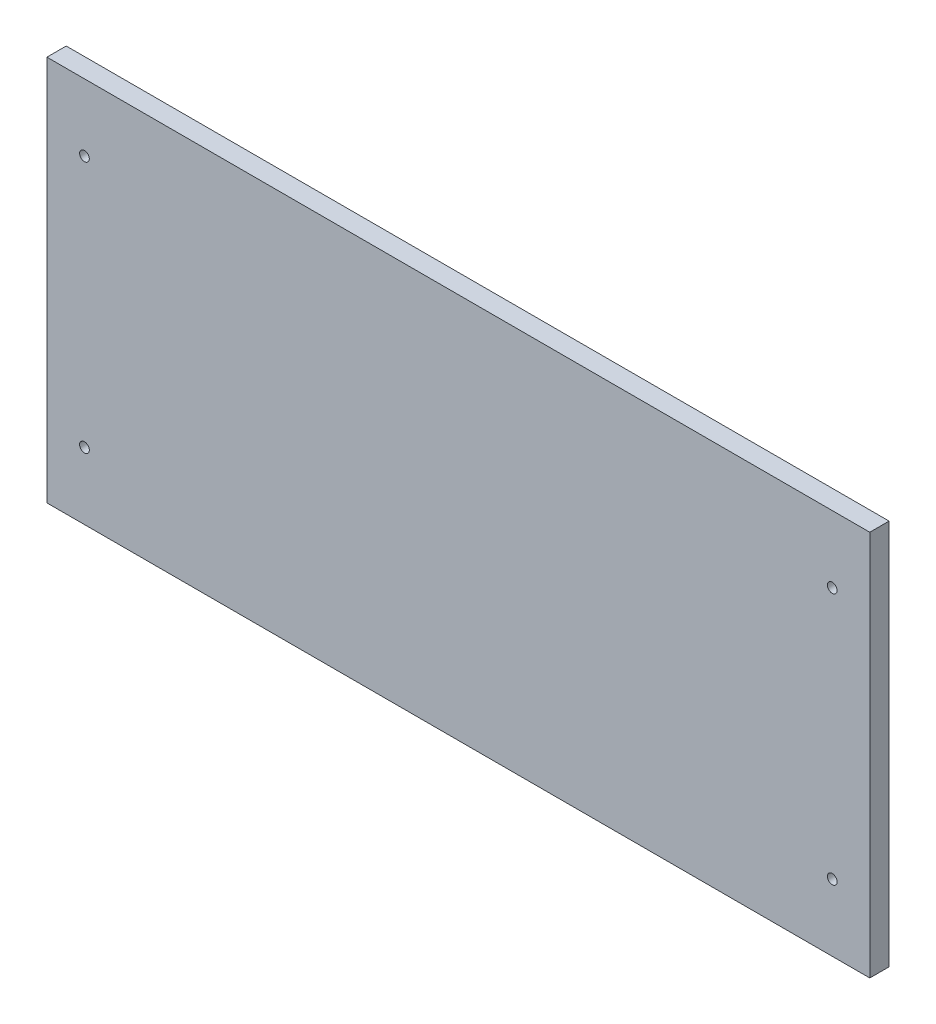
ISO-10303-21;
HEADER;
FILE_DESCRIPTION(('STEP AP214'),'2;1');
FILE_NAME('part.step','',(''),(''),'','','');
FILE_SCHEMA(('AUTOMOTIVE_DESIGN { 1 0 10303 214 1 1 1 1 }'));
ENDSEC;
DATA;
#1=APPLICATION_CONTEXT('core data for automotive mechanical design processes');
#2=APPLICATION_PROTOCOL_DEFINITION('international standard','automotive_design',2000,#1);
#3=PRODUCT_CONTEXT('',#1,'mechanical');
#4=PRODUCT('Part','Part','',(#3));
#5=PRODUCT_RELATED_PRODUCT_CATEGORY('part','',(#4));
#6=PRODUCT_DEFINITION_FORMATION('','',#4);
#7=PRODUCT_DEFINITION_CONTEXT('part definition',#1,'design');
#8=PRODUCT_DEFINITION('design','',#6,#7);
#9=PRODUCT_DEFINITION_SHAPE('','',#8);
#10=(LENGTH_UNIT() NAMED_UNIT(*) SI_UNIT(.MILLI.,.METRE.));
#11=(NAMED_UNIT(*) PLANE_ANGLE_UNIT() SI_UNIT($,.RADIAN.));
#12=(NAMED_UNIT(*) SI_UNIT($,.STERADIAN.) SOLID_ANGLE_UNIT());
#13=UNCERTAINTY_MEASURE_WITH_UNIT(LENGTH_MEASURE(1.E-05),#10,'distance_accuracy_value','');
#14=(GEOMETRIC_REPRESENTATION_CONTEXT(3) GLOBAL_UNCERTAINTY_ASSIGNED_CONTEXT((#13)) GLOBAL_UNIT_ASSIGNED_CONTEXT((#10,
#11,#12)) REPRESENTATION_CONTEXT('',''));
#15=CARTESIAN_POINT('',(0.,0.,0.));
#16=DIRECTION('',(0.,0.,1.));
#17=DIRECTION('',(1.,0.,0.));
#18=AXIS2_PLACEMENT_3D('',#15,#16,#17);
#19=CARTESIAN_POINT('',(0.,0.,6.35));
#20=DIRECTION('',(0.,0.,-1.));
#21=DIRECTION('',(-1.,0.,0.));
#22=AXIS2_PLACEMENT_3D('',#19,#20,#21);
#23=PLANE('',#22);
#24=DIRECTION('',(0.,-1.,0.));
#25=VECTOR('',#24,1.);
#26=CARTESIAN_POINT('',(0.,0.,6.35));
#27=LINE('',#26,#25);
#28=CARTESIAN_POINT('',(0.,127.,6.35));
#29=VERTEX_POINT('',#28);
#30=CARTESIAN_POINT('',(0.,0.,6.35));
#31=VERTEX_POINT('',#30);
#32=EDGE_CURVE('E85',#29,#31,#27,.T.);
#33=ORIENTED_EDGE('',*,*,#32,.T.);
#34=DIRECTION('',(1.,0.,0.));
#35=VECTOR('',#34,1.);
#36=CARTESIAN_POINT('',(0.,0.,6.35));
#37=LINE('',#36,#35);
#38=CARTESIAN_POINT('',(270.7,0.,6.35));
#39=VERTEX_POINT('',#38);
#40=EDGE_CURVE('E80',#31,#39,#37,.T.);
#41=ORIENTED_EDGE('',*,*,#40,.T.);
#42=DIRECTION('',(0.,1.,0.));
#43=VECTOR('',#42,1.);
#44=CARTESIAN_POINT('',(270.7,0.,6.35));
#45=LINE('',#44,#43);
#46=CARTESIAN_POINT('',(270.7,127.,6.35));
#47=VERTEX_POINT('',#46);
#48=EDGE_CURVE('E83',#39,#47,#45,.T.);
#49=ORIENTED_EDGE('',*,*,#48,.T.);
#50=DIRECTION('',(-1.,0.,0.));
#51=VECTOR('',#50,1.);
#52=CARTESIAN_POINT('',(0.,127.,6.35));
#53=LINE('',#52,#51);
#54=EDGE_CURVE('E50',#47,#29,#53,.T.);
#55=ORIENTED_EDGE('',*,*,#54,.T.);
#56=EDGE_LOOP('',(#33,#41,#49,#55));
#57=FACE_BOUND('',#56,.T.);
#58=CARTESIAN_POINT('',(258.35,105.,6.35));
#59=DIRECTION('',(0.,0.,1.));
#60=DIRECTION('',(-1.,0.,0.));
#61=AXIS2_PLACEMENT_3D('',#58,#59,#60);
#62=CIRCLE('',#61,1.60000000000002);
#63=CARTESIAN_POINT('',(256.75,105.,6.35));
#64=VERTEX_POINT('',#63);
#65=EDGE_CURVE('E100',#64,#64,#62,.T.);
#66=ORIENTED_EDGE('',*,*,#65,.F.);
#67=EDGE_LOOP('',(#66));
#68=FACE_BOUND('',#67,.T.);
#69=CARTESIAN_POINT('',(258.35,22.,6.35));
#70=DIRECTION('',(0.,0.,1.));
#71=DIRECTION('',(1.,0.,0.));
#72=AXIS2_PLACEMENT_3D('',#69,#70,#71);
#73=CIRCLE('',#72,1.60000000000002);
#74=CARTESIAN_POINT('',(259.95,22.,6.35));
#75=VERTEX_POINT('',#74);
#76=EDGE_CURVE('E115',#75,#75,#73,.T.);
#77=ORIENTED_EDGE('',*,*,#76,.F.);
#78=EDGE_LOOP('',(#77));
#79=FACE_BOUND('',#78,.T.);
#80=CARTESIAN_POINT('',(12.35,22.,6.35));
#81=DIRECTION('',(0.,0.,1.));
#82=DIRECTION('',(-1.,0.,0.));
#83=AXIS2_PLACEMENT_3D('',#80,#81,#82);
#84=CIRCLE('',#83,1.6);
#85=CARTESIAN_POINT('',(10.75,22.,6.35));
#86=VERTEX_POINT('',#85);
#87=EDGE_CURVE('E121',#86,#86,#84,.T.);
#88=ORIENTED_EDGE('',*,*,#87,.F.);
#89=EDGE_LOOP('',(#88));
#90=FACE_BOUND('',#89,.T.);
#91=CARTESIAN_POINT('',(12.35,105.,6.35));
#92=DIRECTION('',(0.,0.,1.));
#93=DIRECTION('',(1.,0.,0.));
#94=AXIS2_PLACEMENT_3D('',#91,#92,#93);
#95=CIRCLE('',#94,1.60000000000001);
#96=CARTESIAN_POINT('',(13.95,105.,6.35));
#97=VERTEX_POINT('',#96);
#98=EDGE_CURVE('E127',#97,#97,#95,.T.);
#99=ORIENTED_EDGE('',*,*,#98,.F.);
#100=EDGE_LOOP('',(#99));
#101=FACE_BOUND('',#100,.T.);
#102=ADVANCED_FACE('F33',(#57,#68,#79,#90,#101),#23,.F.);
#103=CARTESIAN_POINT('',(0.,0.,0.));
#104=DIRECTION('',(0.,0.,-1.));
#105=DIRECTION('',(-1.,0.,0.));
#106=AXIS2_PLACEMENT_3D('',#103,#104,#105);
#107=PLANE('',#106);
#108=CARTESIAN_POINT('',(12.35,22.,0.));
#109=DIRECTION('',(0.,0.,1.));
#110=DIRECTION('',(-1.,0.,0.));
#111=AXIS2_PLACEMENT_3D('',#108,#109,#110);
#112=CIRCLE('',#111,1.6);
#113=CARTESIAN_POINT('',(10.75,22.,0.));
#114=VERTEX_POINT('',#113);
#115=EDGE_CURVE('E124',#114,#114,#112,.T.);
#116=ORIENTED_EDGE('',*,*,#115,.T.);
#117=EDGE_LOOP('',(#116));
#118=FACE_BOUND('',#117,.T.);
#119=CARTESIAN_POINT('',(258.35,105.,0.));
#120=DIRECTION('',(0.,0.,1.));
#121=DIRECTION('',(-1.,0.,0.));
#122=AXIS2_PLACEMENT_3D('',#119,#120,#121);
#123=CIRCLE('',#122,1.60000000000002);
#124=CARTESIAN_POINT('',(256.75,105.,0.));
#125=VERTEX_POINT('',#124);
#126=EDGE_CURVE('E112',#125,#125,#123,.T.);
#127=ORIENTED_EDGE('',*,*,#126,.T.);
#128=EDGE_LOOP('',(#127));
#129=FACE_BOUND('',#128,.T.);
#130=DIRECTION('',(0.,-1.,0.));
#131=VECTOR('',#130,1.);
#132=CARTESIAN_POINT('',(0.,0.,0.));
#133=LINE('',#132,#131);
#134=CARTESIAN_POINT('',(0.,127.,0.));
#135=VERTEX_POINT('',#134);
#136=CARTESIAN_POINT('',(0.,0.,0.));
#137=VERTEX_POINT('',#136);
#138=EDGE_CURVE('E97',#135,#137,#133,.T.);
#139=ORIENTED_EDGE('',*,*,#138,.F.);
#140=DIRECTION('',(-1.,0.,0.));
#141=VECTOR('',#140,1.);
#142=CARTESIAN_POINT('',(0.,127.,0.));
#143=LINE('',#142,#141);
#144=CARTESIAN_POINT('',(270.7,127.,0.));
#145=VERTEX_POINT('',#144);
#146=EDGE_CURVE('E73',#145,#135,#143,.T.);
#147=ORIENTED_EDGE('',*,*,#146,.F.);
#148=DIRECTION('',(0.,1.,0.));
#149=VECTOR('',#148,1.);
#150=CARTESIAN_POINT('',(270.7,0.,0.));
#151=LINE('',#150,#149);
#152=CARTESIAN_POINT('',(270.7,0.,0.));
#153=VERTEX_POINT('',#152);
#154=EDGE_CURVE('E67',#153,#145,#151,.T.);
#155=ORIENTED_EDGE('',*,*,#154,.F.);
#156=DIRECTION('',(1.,0.,0.));
#157=VECTOR('',#156,1.);
#158=CARTESIAN_POINT('',(0.,0.,0.));
#159=LINE('',#158,#157);
#160=EDGE_CURVE('E89',#137,#153,#159,.T.);
#161=ORIENTED_EDGE('',*,*,#160,.F.);
#162=EDGE_LOOP('',(#139,#147,#155,#161));
#163=FACE_BOUND('',#162,.T.);
#164=CARTESIAN_POINT('',(258.35,22.,0.));
#165=DIRECTION('',(0.,0.,1.));
#166=DIRECTION('',(1.,0.,0.));
#167=AXIS2_PLACEMENT_3D('',#164,#165,#166);
#168=CIRCLE('',#167,1.60000000000002);
#169=CARTESIAN_POINT('',(259.95,22.,0.));
#170=VERTEX_POINT('',#169);
#171=EDGE_CURVE('E118',#170,#170,#168,.T.);
#172=ORIENTED_EDGE('',*,*,#171,.T.);
#173=EDGE_LOOP('',(#172));
#174=FACE_BOUND('',#173,.T.);
#175=CARTESIAN_POINT('',(12.35,105.,0.));
#176=DIRECTION('',(0.,0.,1.));
#177=DIRECTION('',(1.,0.,0.));
#178=AXIS2_PLACEMENT_3D('',#175,#176,#177);
#179=CIRCLE('',#178,1.60000000000001);
#180=CARTESIAN_POINT('',(13.95,105.,0.));
#181=VERTEX_POINT('',#180);
#182=EDGE_CURVE('E130',#181,#181,#179,.T.);
#183=ORIENTED_EDGE('',*,*,#182,.T.);
#184=EDGE_LOOP('',(#183));
#185=FACE_BOUND('',#184,.T.);
#186=ADVANCED_FACE('F108',(#118,#129,#163,#174,#185),#107,.T.);
#187=CARTESIAN_POINT('',(0.,0.,6.35));
#188=DIRECTION('',(1.,0.,0.));
#189=DIRECTION('',(0.,0.,-1.));
#190=AXIS2_PLACEMENT_3D('',#187,#188,#189);
#191=PLANE('',#190);
#192=ORIENTED_EDGE('',*,*,#138,.T.);
#193=DIRECTION('',(0.,0.,-1.));
#194=VECTOR('',#193,1.);
#195=CARTESIAN_POINT('',(0.,0.,6.35));
#196=LINE('',#195,#194);
#197=EDGE_CURVE('E11',#31,#137,#196,.T.);
#198=ORIENTED_EDGE('',*,*,#197,.F.);
#199=ORIENTED_EDGE('',*,*,#32,.F.);
#200=DIRECTION('',(0.,0.,-1.));
#201=VECTOR('',#200,1.);
#202=CARTESIAN_POINT('',(0.,127.,6.35));
#203=LINE('',#202,#201);
#204=EDGE_CURVE('E93',#29,#135,#203,.T.);
#205=ORIENTED_EDGE('',*,*,#204,.T.);
#206=EDGE_LOOP('',(#192,#198,#199,#205));
#207=FACE_BOUND('',#206,.T.);
#208=ADVANCED_FACE('F35',(#207),#191,.F.);
#209=CARTESIAN_POINT('',(0.,0.,6.35));
#210=DIRECTION('',(0.,1.,0.));
#211=DIRECTION('',(0.,0.,1.));
#212=AXIS2_PLACEMENT_3D('',#209,#210,#211);
#213=PLANE('',#212);
#214=ORIENTED_EDGE('',*,*,#160,.T.);
#215=DIRECTION('',(0.,0.,-1.));
#216=VECTOR('',#215,1.);
#217=CARTESIAN_POINT('',(270.7,0.,6.35));
#218=LINE('',#217,#216);
#219=EDGE_CURVE('E42',#39,#153,#218,.T.);
#220=ORIENTED_EDGE('',*,*,#219,.F.);
#221=ORIENTED_EDGE('',*,*,#40,.F.);
#222=ORIENTED_EDGE('',*,*,#197,.T.);
#223=EDGE_LOOP('',(#214,#220,#221,#222));
#224=FACE_BOUND('',#223,.T.);
#225=ADVANCED_FACE('F88',(#224),#213,.F.);
#226=CARTESIAN_POINT('',(270.7,0.,6.35));
#227=DIRECTION('',(-1.,0.,0.));
#228=DIRECTION('',(0.,0.,1.));
#229=AXIS2_PLACEMENT_3D('',#226,#227,#228);
#230=PLANE('',#229);
#231=ORIENTED_EDGE('',*,*,#154,.T.);
#232=DIRECTION('',(0.,0.,-1.));
#233=VECTOR('',#232,1.);
#234=CARTESIAN_POINT('',(270.7,127.,6.35));
#235=LINE('',#234,#233);
#236=EDGE_CURVE('E90',#47,#145,#235,.T.);
#237=ORIENTED_EDGE('',*,*,#236,.F.);
#238=ORIENTED_EDGE('',*,*,#48,.F.);
#239=ORIENTED_EDGE('',*,*,#219,.T.);
#240=EDGE_LOOP('',(#231,#237,#238,#239));
#241=FACE_BOUND('',#240,.T.);
#242=ADVANCED_FACE('F91',(#241),#230,.F.);
#243=CARTESIAN_POINT('',(0.,127.,6.35));
#244=DIRECTION('',(0.,-1.,0.));
#245=DIRECTION('',(0.,0.,-1.));
#246=AXIS2_PLACEMENT_3D('',#243,#244,#245);
#247=PLANE('',#246);
#248=ORIENTED_EDGE('',*,*,#146,.T.);
#249=ORIENTED_EDGE('',*,*,#204,.F.);
#250=ORIENTED_EDGE('',*,*,#54,.F.);
#251=ORIENTED_EDGE('',*,*,#236,.T.);
#252=EDGE_LOOP('',(#248,#249,#250,#251));
#253=FACE_BOUND('',#252,.T.);
#254=ADVANCED_FACE('F105',(#253),#247,.F.);
#255=CARTESIAN_POINT('',(258.35,105.,6.35));
#256=DIRECTION('',(0.,0.,-1.));
#257=DIRECTION('',(-1.,0.,0.));
#258=AXIS2_PLACEMENT_3D('',#255,#256,#257);
#259=CYLINDRICAL_SURFACE('',#258,1.60000000000002);
#260=ORIENTED_EDGE('',*,*,#65,.T.);
#261=EDGE_LOOP('',(#260));
#262=FACE_BOUND('',#261,.T.);
#263=ORIENTED_EDGE('',*,*,#126,.F.);
#264=EDGE_LOOP('',(#263));
#265=FACE_BOUND('',#264,.T.);
#266=ADVANCED_FACE('F147',(#262,#265),#259,.F.);
#267=CARTESIAN_POINT('',(258.35,22.,6.35));
#268=DIRECTION('',(0.,0.,-1.));
#269=DIRECTION('',(-1.,0.,0.));
#270=AXIS2_PLACEMENT_3D('',#267,#268,#269);
#271=CYLINDRICAL_SURFACE('',#270,1.60000000000002);
#272=ORIENTED_EDGE('',*,*,#76,.T.);
#273=EDGE_LOOP('',(#272));
#274=FACE_BOUND('',#273,.T.);
#275=ORIENTED_EDGE('',*,*,#171,.F.);
#276=EDGE_LOOP('',(#275));
#277=FACE_BOUND('',#276,.T.);
#278=ADVANCED_FACE('F193',(#274,#277),#271,.F.);
#279=CARTESIAN_POINT('',(12.35,22.,6.35));
#280=DIRECTION('',(0.,0.,-1.));
#281=DIRECTION('',(-1.,0.,0.));
#282=AXIS2_PLACEMENT_3D('',#279,#280,#281);
#283=CYLINDRICAL_SURFACE('',#282,1.6);
#284=ORIENTED_EDGE('',*,*,#87,.T.);
#285=EDGE_LOOP('',(#284));
#286=FACE_BOUND('',#285,.T.);
#287=ORIENTED_EDGE('',*,*,#115,.F.);
#288=EDGE_LOOP('',(#287));
#289=FACE_BOUND('',#288,.T.);
#290=ADVANCED_FACE('F201',(#286,#289),#283,.F.);
#291=CARTESIAN_POINT('',(12.35,105.,6.35));
#292=DIRECTION('',(0.,0.,-1.));
#293=DIRECTION('',(-1.,0.,0.));
#294=AXIS2_PLACEMENT_3D('',#291,#292,#293);
#295=CYLINDRICAL_SURFACE('',#294,1.60000000000001);
#296=ORIENTED_EDGE('',*,*,#98,.T.);
#297=EDGE_LOOP('',(#296));
#298=FACE_BOUND('',#297,.T.);
#299=ORIENTED_EDGE('',*,*,#182,.F.);
#300=EDGE_LOOP('',(#299));
#301=FACE_BOUND('',#300,.T.);
#302=ADVANCED_FACE('F136',(#298,#301),#295,.F.);
#303=CLOSED_SHELL('',(#102,#186,#208,#225,#242,#254,#266,#278,#290,#302));
#304=MANIFOLD_SOLID_BREP('B2',#303);
#305=ADVANCED_BREP_SHAPE_REPRESENTATION('',(#18,#304),#14);
#306=SHAPE_DEFINITION_REPRESENTATION(#9,#305);
ENDSEC;
END-ISO-10303-21;
